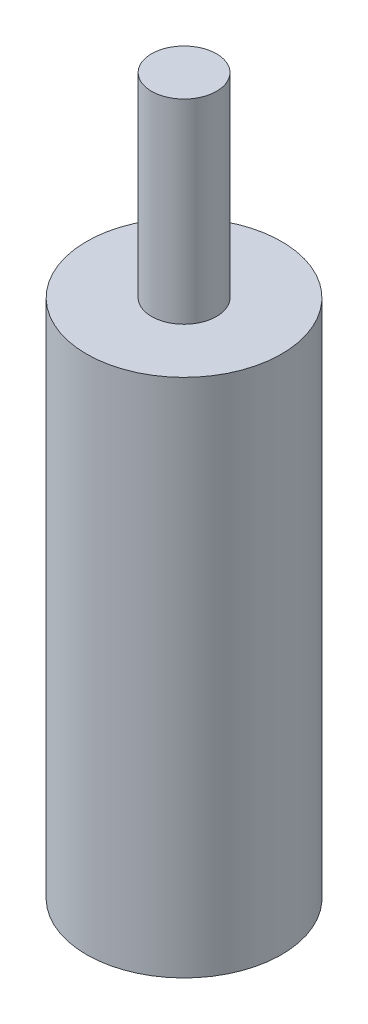
ISO-10303-21;
HEADER;
FILE_DESCRIPTION(('STEP AP214'),'2;1');
FILE_NAME('part.step','',(''),(''),'','','');
FILE_SCHEMA(('AUTOMOTIVE_DESIGN { 1 0 10303 214 1 1 1 1 }'));
ENDSEC;
DATA;
#1=APPLICATION_CONTEXT('core data for automotive mechanical design processes');
#2=APPLICATION_PROTOCOL_DEFINITION('international standard','automotive_design',2000,#1);
#3=PRODUCT_CONTEXT('',#1,'mechanical');
#4=PRODUCT('Part','Part','',(#3));
#5=PRODUCT_RELATED_PRODUCT_CATEGORY('part','',(#4));
#6=PRODUCT_DEFINITION_FORMATION('','',#4);
#7=PRODUCT_DEFINITION_CONTEXT('part definition',#1,'design');
#8=PRODUCT_DEFINITION('design','',#6,#7);
#9=PRODUCT_DEFINITION_SHAPE('','',#8);
#10=(LENGTH_UNIT() NAMED_UNIT(*) SI_UNIT(.MILLI.,.METRE.));
#11=(NAMED_UNIT(*) PLANE_ANGLE_UNIT() SI_UNIT($,.RADIAN.));
#12=(NAMED_UNIT(*) SI_UNIT($,.STERADIAN.) SOLID_ANGLE_UNIT());
#13=UNCERTAINTY_MEASURE_WITH_UNIT(LENGTH_MEASURE(1.E-05),#10,'distance_accuracy_value','');
#14=(GEOMETRIC_REPRESENTATION_CONTEXT(3) GLOBAL_UNCERTAINTY_ASSIGNED_CONTEXT((#13)) GLOBAL_UNIT_ASSIGNED_CONTEXT((#10,
#11,#12)) REPRESENTATION_CONTEXT('',''));
#15=CARTESIAN_POINT('',(0.,0.,0.));
#16=DIRECTION('',(0.,0.,1.));
#17=DIRECTION('',(1.,0.,0.));
#18=AXIS2_PLACEMENT_3D('',#15,#16,#17);
#19=CARTESIAN_POINT('',(0.,25.4,0.));
#20=DIRECTION('',(0.,-1.,0.));
#21=DIRECTION('',(0.,0.,-1.));
#22=AXIS2_PLACEMENT_3D('',#19,#20,#21);
#23=CYLINDRICAL_SURFACE('',#22,4.7625);
#24=CARTESIAN_POINT('',(0.,25.4,0.));
#25=DIRECTION('',(0.,1.,0.));
#26=DIRECTION('',(0.,0.,1.));
#27=AXIS2_PLACEMENT_3D('',#24,#25,#26);
#28=CIRCLE('',#27,4.7625);
#29=CARTESIAN_POINT('',(0.,25.4,4.7625));
#30=VERTEX_POINT('',#29);
#31=EDGE_CURVE('E42',#30,#30,#28,.T.);
#32=ORIENTED_EDGE('',*,*,#31,.F.);
#33=EDGE_LOOP('',(#32));
#34=FACE_BOUND('',#33,.T.);
#35=CARTESIAN_POINT('',(0.,0.,0.));
#36=DIRECTION('',(0.,1.,0.));
#37=DIRECTION('',(0.,0.,1.));
#38=AXIS2_PLACEMENT_3D('',#35,#36,#37);
#39=CIRCLE('',#38,4.7625);
#40=CARTESIAN_POINT('',(0.,0.,4.7625));
#41=VERTEX_POINT('',#40);
#42=EDGE_CURVE('E37',#41,#41,#39,.T.);
#43=ORIENTED_EDGE('',*,*,#42,.T.);
#44=EDGE_LOOP('',(#43));
#45=FACE_BOUND('',#44,.T.);
#46=ADVANCED_FACE('F40',(#34,#45),#23,.T.);
#47=CARTESIAN_POINT('',(0.,25.4,0.));
#48=DIRECTION('',(0.,1.,0.));
#49=DIRECTION('',(0.,0.,1.));
#50=AXIS2_PLACEMENT_3D('',#47,#48,#49);
#51=PLANE('',#50);
#52=CARTESIAN_POINT('',(0.,25.4,0.));
#53=DIRECTION('',(0.,1.,0.));
#54=DIRECTION('',(0.,0.,1.));
#55=AXIS2_PLACEMENT_3D('',#52,#53,#54);
#56=CIRCLE('',#55,1.5875);
#57=CARTESIAN_POINT('',(0.,25.4,-1.5875));
#58=VERTEX_POINT('',#57);
#59=EDGE_CURVE('E10',#58,#58,#56,.T.);
#60=ORIENTED_EDGE('',*,*,#59,.F.);
#61=EDGE_LOOP('',(#60));
#62=FACE_BOUND('',#61,.T.);
#63=ORIENTED_EDGE('',*,*,#31,.T.);
#64=EDGE_LOOP('',(#63));
#65=FACE_BOUND('',#64,.T.);
#66=ADVANCED_FACE('F71',(#62,#65),#51,.T.);
#67=CARTESIAN_POINT('',(0.,0.,0.));
#68=DIRECTION('',(0.,1.,0.));
#69=DIRECTION('',(0.,0.,1.));
#70=AXIS2_PLACEMENT_3D('',#67,#68,#69);
#71=PLANE('',#70);
#72=CARTESIAN_POINT('',(0.,0.,0.));
#73=DIRECTION('',(0.,-1.,0.));
#74=DIRECTION('',(0.,0.,-1.));
#75=AXIS2_PLACEMENT_3D('',#72,#73,#74);
#76=CIRCLE('',#75,1.5875);
#77=CARTESIAN_POINT('',(0.,0.,-1.5875));
#78=VERTEX_POINT('',#77);
#79=EDGE_CURVE('E53',#78,#78,#76,.T.);
#80=ORIENTED_EDGE('',*,*,#79,.F.);
#81=EDGE_LOOP('',(#80));
#82=FACE_BOUND('',#81,.T.);
#83=ORIENTED_EDGE('',*,*,#42,.F.);
#84=EDGE_LOOP('',(#83));
#85=FACE_BOUND('',#84,.T.);
#86=ADVANCED_FACE('F66',(#82,#85),#71,.F.);
#87=CARTESIAN_POINT('',(0.,34.925,0.));
#88=DIRECTION('',(0.,-1.,0.));
#89=DIRECTION('',(0.,0.,-1.));
#90=AXIS2_PLACEMENT_3D('',#87,#88,#89);
#91=CYLINDRICAL_SURFACE('',#90,1.5875);
#92=CARTESIAN_POINT('',(0.,34.925,0.));
#93=DIRECTION('',(0.,1.,0.));
#94=DIRECTION('',(0.,0.,1.));
#95=AXIS2_PLACEMENT_3D('',#92,#93,#94);
#96=CIRCLE('',#95,1.5875);
#97=CARTESIAN_POINT('',(0.,34.925,-1.5875));
#98=VERTEX_POINT('',#97);
#99=EDGE_CURVE('E49',#98,#98,#96,.T.);
#100=CARTESIAN_POINT('',(0.,34.925,-1.5875));
#101=CARTESIAN_POINT('',(0.,34.82578125,-1.5875));
#102=CARTESIAN_POINT('',(0.,34.7265625,-1.5875));
#103=CARTESIAN_POINT('',(0.,34.528125,-1.5875));
#104=CARTESIAN_POINT('',(0.,34.42890625,-1.5875));
#105=CARTESIAN_POINT('',(0.,34.23046875,-1.5875));
#106=CARTESIAN_POINT('',(0.,34.13125,-1.5875));
#107=CARTESIAN_POINT('',(0.,33.9328125,-1.5875));
#108=CARTESIAN_POINT('',(0.,33.83359375,-1.5875));
#109=CARTESIAN_POINT('',(0.,33.63515625,-1.5875));
#110=CARTESIAN_POINT('',(0.,33.5359375,-1.5875));
#111=CARTESIAN_POINT('',(0.,33.3375,-1.5875));
#112=CARTESIAN_POINT('',(0.,33.23828125,-1.5875));
#113=CARTESIAN_POINT('',(0.,33.03984375,-1.5875));
#114=CARTESIAN_POINT('',(0.,32.940625,-1.5875));
#115=CARTESIAN_POINT('',(0.,32.7421875,-1.5875));
#116=CARTESIAN_POINT('',(0.,32.64296875,-1.5875));
#117=CARTESIAN_POINT('',(0.,32.44453125,-1.5875));
#118=CARTESIAN_POINT('',(0.,32.3453125,-1.5875));
#119=CARTESIAN_POINT('',(0.,32.146875,-1.5875));
#120=CARTESIAN_POINT('',(0.,32.04765625,-1.5875));
#121=CARTESIAN_POINT('',(0.,31.84921875,-1.5875));
#122=CARTESIAN_POINT('',(0.,31.75,-1.5875));
#123=CARTESIAN_POINT('',(0.,31.5515625,-1.5875));
#124=CARTESIAN_POINT('',(0.,31.45234375,-1.5875));
#125=CARTESIAN_POINT('',(0.,31.25390625,-1.5875));
#126=CARTESIAN_POINT('',(0.,31.1546875,-1.5875));
#127=CARTESIAN_POINT('',(0.,30.95625,-1.5875));
#128=CARTESIAN_POINT('',(0.,30.85703125,-1.5875));
#129=CARTESIAN_POINT('',(0.,30.65859375,-1.5875));
#130=CARTESIAN_POINT('',(0.,30.559375,-1.5875));
#131=CARTESIAN_POINT('',(0.,30.3609375,-1.5875));
#132=CARTESIAN_POINT('',(0.,30.26171875,-1.5875));
#133=CARTESIAN_POINT('',(0.,30.06328125,-1.5875));
#134=CARTESIAN_POINT('',(0.,29.9640625,-1.5875));
#135=CARTESIAN_POINT('',(0.,29.765625,-1.5875));
#136=CARTESIAN_POINT('',(0.,29.66640625,-1.5875));
#137=CARTESIAN_POINT('',(0.,29.46796875,-1.5875));
#138=CARTESIAN_POINT('',(0.,29.36875,-1.5875));
#139=CARTESIAN_POINT('',(0.,29.1703125,-1.5875));
#140=CARTESIAN_POINT('',(0.,29.07109375,-1.5875));
#141=CARTESIAN_POINT('',(0.,28.87265625,-1.5875));
#142=CARTESIAN_POINT('',(0.,28.7734375,-1.5875));
#143=CARTESIAN_POINT('',(0.,28.575,-1.5875));
#144=CARTESIAN_POINT('',(0.,28.47578125,-1.5875));
#145=CARTESIAN_POINT('',(0.,28.27734375,-1.5875));
#146=CARTESIAN_POINT('',(0.,28.178125,-1.5875));
#147=CARTESIAN_POINT('',(0.,27.9796875,-1.5875));
#148=CARTESIAN_POINT('',(0.,27.88046875,-1.5875));
#149=CARTESIAN_POINT('',(0.,27.68203125,-1.5875));
#150=CARTESIAN_POINT('',(0.,27.5828125,-1.5875));
#151=CARTESIAN_POINT('',(0.,27.384375,-1.5875));
#152=CARTESIAN_POINT('',(0.,27.28515625,-1.5875));
#153=CARTESIAN_POINT('',(0.,27.08671875,-1.5875));
#154=CARTESIAN_POINT('',(0.,26.9875,-1.5875));
#155=CARTESIAN_POINT('',(0.,26.7890625,-1.5875));
#156=CARTESIAN_POINT('',(0.,26.68984375,-1.5875));
#157=CARTESIAN_POINT('',(0.,26.49140625,-1.5875));
#158=CARTESIAN_POINT('',(0.,26.3921875,-1.5875));
#159=CARTESIAN_POINT('',(0.,26.19375,-1.5875));
#160=CARTESIAN_POINT('',(0.,26.09453125,-1.5875));
#161=CARTESIAN_POINT('',(0.,25.89609375,-1.5875));
#162=CARTESIAN_POINT('',(0.,25.796875,-1.5875));
#163=CARTESIAN_POINT('',(0.,25.5984375,-1.5875));
#164=CARTESIAN_POINT('',(0.,25.49921875,-1.5875));
#165=CARTESIAN_POINT('',(0.,25.4,-1.5875));
#166=B_SPLINE_CURVE_WITH_KNOTS('',3,(#100,#101,#102,#103,#104,#105,#106,#107,#108,#109,#110,
#111,#112,#113,#114,#115,#116,#117,#118,#119,#120,#121,#122,#123,#124,#125,#126,#127,#128,#129,
#130,#131,#132,#133,#134,#135,#136,#137,#138,#139,#140,#141,#142,#143,#144,#145,#146,#147,#148,
#149,#150,#151,#152,#153,#154,#155,#156,#157,#158,#159,#160,#161,#162,#163,#164,#165),
.UNSPECIFIED.,.F.,.F.,(4,2,2,2,2,2,2,2,2,2,2,2,2,2,2,2,2,2,2,2,2,2,2,2,2,2,2,2,2,2,2,2,4),(0.,
0.29765625,0.5953125,0.892968750000001,1.190625,1.48828125,1.7859375,2.08359375,2.38125,
2.67890625,2.9765625,3.27421875,3.571875,3.86953125,4.1671875,4.46484375,4.7625,5.06015625,
5.3578125,5.65546875,5.953125,6.25078125,6.5484375,6.84609375,7.14375,7.44140625,7.7390625,
8.03671875,8.334375,8.63203125,8.9296875,9.22734375,9.525),.UNSPECIFIED.);
#167=EDGE_CURVE('BSEAM75',#98,#58,#166,.T.);
#168=ORIENTED_EDGE('',*,*,#99,.F.);
#169=ORIENTED_EDGE('',*,*,#59,.T.);
#170=ORIENTED_EDGE('',*,*,#167,.T.);
#171=ORIENTED_EDGE('',*,*,#167,.F.);
#172=EDGE_LOOP('',(#168,#170,#169,#171));
#173=FACE_BOUND('',#172,.T.);
#174=ADVANCED_FACE('F75',(#173),#91,.T.);
#175=CARTESIAN_POINT('',(0.,34.925,0.));
#176=DIRECTION('',(0.,1.,0.));
#177=DIRECTION('',(0.,0.,1.));
#178=AXIS2_PLACEMENT_3D('',#175,#176,#177);
#179=PLANE('',#178);
#180=ORIENTED_EDGE('',*,*,#99,.T.);
#181=EDGE_LOOP('',(#180));
#182=FACE_BOUND('',#181,.T.);
#183=ADVANCED_FACE('F63',(#182),#179,.T.);
#184=CARTESIAN_POINT('',(0.,9.525,0.));
#185=DIRECTION('',(0.,-1.,0.));
#186=DIRECTION('',(0.,0.,-1.));
#187=AXIS2_PLACEMENT_3D('',#184,#185,#186);
#188=CYLINDRICAL_SURFACE('',#187,1.5875);
#189=CARTESIAN_POINT('',(0.,9.525,0.));
#190=DIRECTION('',(0.,-1.,0.));
#191=DIRECTION('',(0.,0.,-1.));
#192=AXIS2_PLACEMENT_3D('',#189,#190,#191);
#193=CIRCLE('',#192,1.5875);
#194=CARTESIAN_POINT('',(0.,9.525,-1.5875));
#195=VERTEX_POINT('',#194);
#196=EDGE_CURVE('E52',#195,#195,#193,.T.);
#197=CARTESIAN_POINT('',(0.,9.525,-1.5875));
#198=CARTESIAN_POINT('',(0.,9.42578125,-1.5875));
#199=CARTESIAN_POINT('',(0.,9.3265625,-1.5875));
#200=CARTESIAN_POINT('',(0.,9.128125,-1.5875));
#201=CARTESIAN_POINT('',(0.,9.02890625,-1.5875));
#202=CARTESIAN_POINT('',(0.,8.83046875,-1.5875));
#203=CARTESIAN_POINT('',(0.,8.73125,-1.5875));
#204=CARTESIAN_POINT('',(0.,8.5328125,-1.5875));
#205=CARTESIAN_POINT('',(0.,8.43359375,-1.5875));
#206=CARTESIAN_POINT('',(0.,8.23515625,-1.5875));
#207=CARTESIAN_POINT('',(0.,8.1359375,-1.5875));
#208=CARTESIAN_POINT('',(0.,7.9375,-1.5875));
#209=CARTESIAN_POINT('',(0.,7.83828125,-1.5875));
#210=CARTESIAN_POINT('',(0.,7.63984375,-1.5875));
#211=CARTESIAN_POINT('',(0.,7.540625,-1.5875));
#212=CARTESIAN_POINT('',(0.,7.3421875,-1.5875));
#213=CARTESIAN_POINT('',(0.,7.24296875,-1.5875));
#214=CARTESIAN_POINT('',(0.,7.04453125,-1.5875));
#215=CARTESIAN_POINT('',(0.,6.9453125,-1.5875));
#216=CARTESIAN_POINT('',(0.,6.746875,-1.5875));
#217=CARTESIAN_POINT('',(0.,6.64765625,-1.5875));
#218=CARTESIAN_POINT('',(0.,6.44921875,-1.5875));
#219=CARTESIAN_POINT('',(0.,6.35,-1.5875));
#220=CARTESIAN_POINT('',(0.,6.1515625,-1.5875));
#221=CARTESIAN_POINT('',(0.,6.05234375,-1.5875));
#222=CARTESIAN_POINT('',(0.,5.85390625,-1.5875));
#223=CARTESIAN_POINT('',(0.,5.7546875,-1.5875));
#224=CARTESIAN_POINT('',(0.,5.55625,-1.5875));
#225=CARTESIAN_POINT('',(0.,5.45703125,-1.5875));
#226=CARTESIAN_POINT('',(0.,5.25859375,-1.5875));
#227=CARTESIAN_POINT('',(0.,5.159375,-1.5875));
#228=CARTESIAN_POINT('',(0.,4.9609375,-1.5875));
#229=CARTESIAN_POINT('',(0.,4.86171875,-1.5875));
#230=CARTESIAN_POINT('',(0.,4.66328125,-1.5875));
#231=CARTESIAN_POINT('',(0.,4.5640625,-1.5875));
#232=CARTESIAN_POINT('',(0.,4.365625,-1.5875));
#233=CARTESIAN_POINT('',(0.,4.26640625,-1.5875));
#234=CARTESIAN_POINT('',(0.,4.06796875,-1.5875));
#235=CARTESIAN_POINT('',(0.,3.96875,-1.5875));
#236=CARTESIAN_POINT('',(0.,3.7703125,-1.5875));
#237=CARTESIAN_POINT('',(0.,3.67109375,-1.5875));
#238=CARTESIAN_POINT('',(0.,3.47265625,-1.5875));
#239=CARTESIAN_POINT('',(0.,3.3734375,-1.5875));
#240=CARTESIAN_POINT('',(0.,3.175,-1.5875));
#241=CARTESIAN_POINT('',(0.,3.07578125,-1.5875));
#242=CARTESIAN_POINT('',(0.,2.87734375,-1.5875));
#243=CARTESIAN_POINT('',(0.,2.778125,-1.5875));
#244=CARTESIAN_POINT('',(0.,2.5796875,-1.5875));
#245=CARTESIAN_POINT('',(0.,2.48046875,-1.5875));
#246=CARTESIAN_POINT('',(0.,2.28203125,-1.5875));
#247=CARTESIAN_POINT('',(0.,2.1828125,-1.5875));
#248=CARTESIAN_POINT('',(0.,1.984375,-1.5875));
#249=CARTESIAN_POINT('',(0.,1.88515625,-1.5875));
#250=CARTESIAN_POINT('',(0.,1.68671875,-1.5875));
#251=CARTESIAN_POINT('',(0.,1.5875,-1.5875));
#252=CARTESIAN_POINT('',(0.,1.3890625,-1.5875));
#253=CARTESIAN_POINT('',(0.,1.28984375,-1.5875));
#254=CARTESIAN_POINT('',(0.,1.09140625,-1.5875));
#255=CARTESIAN_POINT('',(0.,0.992187500000001,-1.5875));
#256=CARTESIAN_POINT('',(0.,0.793750000000001,-1.5875));
#257=CARTESIAN_POINT('',(0.,0.69453125,-1.5875));
#258=CARTESIAN_POINT('',(0.,0.49609375,-1.5875));
#259=CARTESIAN_POINT('',(0.,0.396875,-1.5875));
#260=CARTESIAN_POINT('',(0.,0.1984375,-1.5875));
#261=CARTESIAN_POINT('',(0.,0.0992187500000001,-1.5875));
#262=CARTESIAN_POINT('',(0.,0.,-1.5875));
#263=B_SPLINE_CURVE_WITH_KNOTS('',3,(#197,#198,#199,#200,#201,#202,#203,#204,#205,#206,#207,
#208,#209,#210,#211,#212,#213,#214,#215,#216,#217,#218,#219,#220,#221,#222,#223,#224,#225,#226,
#227,#228,#229,#230,#231,#232,#233,#234,#235,#236,#237,#238,#239,#240,#241,#242,#243,#244,#245,
#246,#247,#248,#249,#250,#251,#252,#253,#254,#255,#256,#257,#258,#259,#260,#261,#262),
.UNSPECIFIED.,.F.,.F.,(4,2,2,2,2,2,2,2,2,2,2,2,2,2,2,2,2,2,2,2,2,2,2,2,2,2,2,2,2,2,2,2,4),(0.,
0.29765625,0.5953125,0.892968750000001,1.190625,1.48828125,1.7859375,2.08359375,2.38125,
2.67890625,2.9765625,3.27421875,3.571875,3.86953125,4.1671875,4.46484375,4.7625,5.06015625,
5.3578125,5.65546875,5.953125,6.25078125,6.5484375,6.84609375,7.14375,7.44140625,7.7390625,
8.03671875,8.334375,8.63203125,8.9296875,9.22734375,9.525),.UNSPECIFIED.);
#264=EDGE_CURVE('BSEAM65',#195,#78,#263,.T.);
#265=ORIENTED_EDGE('',*,*,#196,.F.);
#266=ORIENTED_EDGE('',*,*,#79,.T.);
#267=ORIENTED_EDGE('',*,*,#264,.T.);
#268=ORIENTED_EDGE('',*,*,#264,.F.);
#269=EDGE_LOOP('',(#265,#267,#266,#268));
#270=FACE_BOUND('',#269,.T.);
#271=ADVANCED_FACE('F65',(#270),#188,.F.);
#272=CARTESIAN_POINT('',(0.,9.525,0.));
#273=DIRECTION('',(0.,-1.,0.));
#274=DIRECTION('',(0.,0.,-1.));
#275=AXIS2_PLACEMENT_3D('',#272,#273,#274);
#276=PLANE('',#275);
#277=ORIENTED_EDGE('',*,*,#196,.T.);
#278=EDGE_LOOP('',(#277));
#279=FACE_BOUND('',#278,.T.);
#280=ADVANCED_FACE('F58',(#279),#276,.T.);
#281=CLOSED_SHELL('',(#46,#66,#86,#174,#183,#271,#280));
#282=MANIFOLD_SOLID_BREP('B2',#281);
#283=ADVANCED_BREP_SHAPE_REPRESENTATION('',(#18,#282),#14);
#284=SHAPE_DEFINITION_REPRESENTATION(#9,#283);
ENDSEC;
END-ISO-10303-21;
